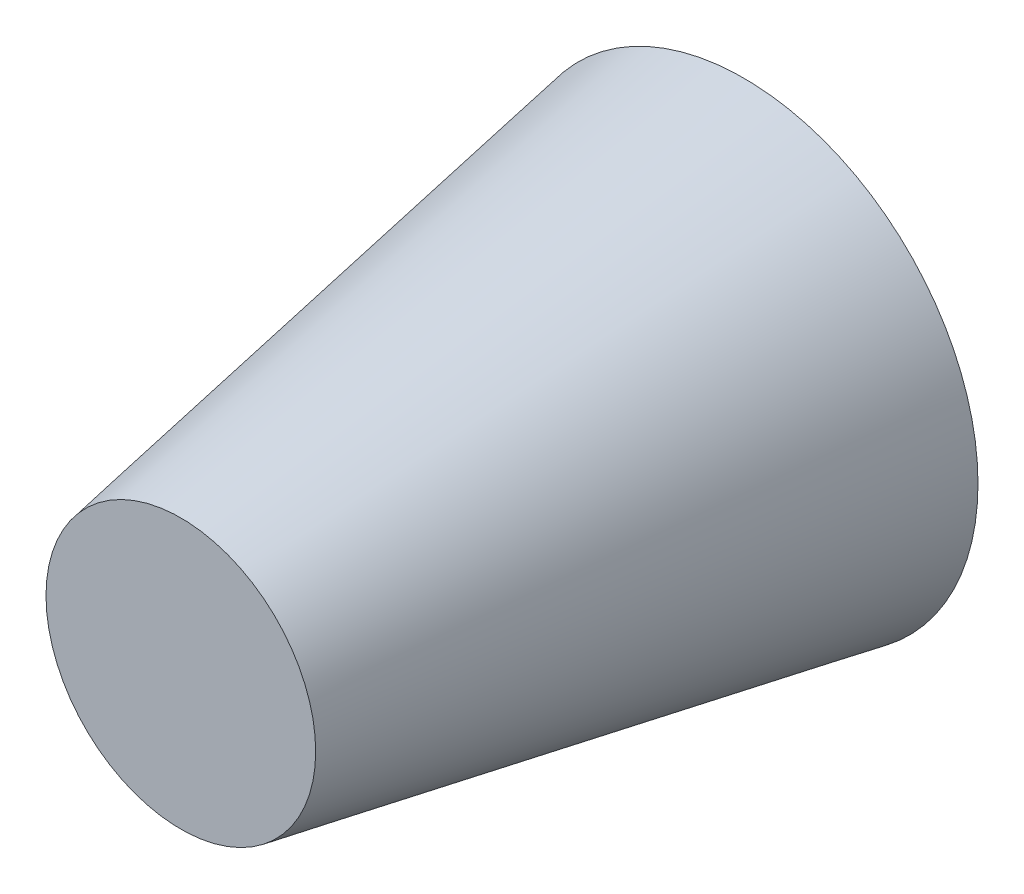
ISO-10303-21;
HEADER;
FILE_DESCRIPTION(('STEP AP214'),'2;1');
FILE_NAME('part.step','',(''),(''),'','','');
FILE_SCHEMA(('AUTOMOTIVE_DESIGN { 1 0 10303 214 1 1 1 1 }'));
ENDSEC;
DATA;
#1=APPLICATION_CONTEXT('core data for automotive mechanical design processes');
#2=APPLICATION_PROTOCOL_DEFINITION('international standard','automotive_design',2000,#1);
#3=PRODUCT_CONTEXT('',#1,'mechanical');
#4=PRODUCT('Part','Part','',(#3));
#5=PRODUCT_RELATED_PRODUCT_CATEGORY('part','',(#4));
#6=PRODUCT_DEFINITION_FORMATION('','',#4);
#7=PRODUCT_DEFINITION_CONTEXT('part definition',#1,'design');
#8=PRODUCT_DEFINITION('design','',#6,#7);
#9=PRODUCT_DEFINITION_SHAPE('','',#8);
#10=(LENGTH_UNIT() NAMED_UNIT(*) SI_UNIT(.MILLI.,.METRE.));
#11=(NAMED_UNIT(*) PLANE_ANGLE_UNIT() SI_UNIT($,.RADIAN.));
#12=(NAMED_UNIT(*) SI_UNIT($,.STERADIAN.) SOLID_ANGLE_UNIT());
#13=UNCERTAINTY_MEASURE_WITH_UNIT(LENGTH_MEASURE(1.E-05),#10,'distance_accuracy_value','');
#14=(GEOMETRIC_REPRESENTATION_CONTEXT(3) GLOBAL_UNCERTAINTY_ASSIGNED_CONTEXT((#13)) GLOBAL_UNIT_ASSIGNED_CONTEXT((#10,
#11,#12)) REPRESENTATION_CONTEXT('',''));
#15=CARTESIAN_POINT('',(0.,0.,0.));
#16=DIRECTION('',(0.,0.,1.));
#17=DIRECTION('',(1.,0.,0.));
#18=AXIS2_PLACEMENT_3D('',#15,#16,#17);
#19=CARTESIAN_POINT('',(0.,40.7624811993621,0.));
#20=DIRECTION('',(0.,0.,-1.));
#21=DIRECTION('',(1.,0.,0.));
#22=AXIS2_PLACEMENT_3D('',#19,#20,#21);
#23=CONICAL_SURFACE('',#22,20.7901294936884,0.174532925199433);
#24=CARTESIAN_POINT('',(0.,40.7624811993621,50.));
#25=DIRECTION('',(0.,0.,1.));
#26=DIRECTION('',(1.,0.,0.));
#27=AXIS2_PLACEMENT_3D('',#24,#25,#26);
#28=CIRCLE('',#27,11.9737804582651);
#29=CARTESIAN_POINT('',(11.9737804582651,40.7624811993621,50.));
#30=VERTEX_POINT('',#29);
#31=EDGE_CURVE('E10',#30,#30,#28,.T.);
#32=ORIENTED_EDGE('',*,*,#31,.F.);
#33=EDGE_LOOP('',(#32));
#34=FACE_BOUND('',#33,.T.);
#35=CARTESIAN_POINT('',(0.,40.7624811993621,0.));
#36=DIRECTION('',(0.,0.,1.));
#37=DIRECTION('',(1.,0.,0.));
#38=AXIS2_PLACEMENT_3D('',#35,#36,#37);
#39=CIRCLE('',#38,20.7901294936884);
#40=CARTESIAN_POINT('',(20.7901294936884,40.7624811993621,0.));
#41=VERTEX_POINT('',#40);
#42=EDGE_CURVE('E37',#41,#41,#39,.T.);
#43=ORIENTED_EDGE('',*,*,#42,.T.);
#44=EDGE_LOOP('',(#43));
#45=FACE_BOUND('',#44,.T.);
#46=ADVANCED_FACE('F31',(#34,#45),#23,.T.);
#47=CARTESIAN_POINT('',(0.,40.7624811993621,50.));
#48=DIRECTION('',(0.,0.,1.));
#49=DIRECTION('',(1.,0.,0.));
#50=AXIS2_PLACEMENT_3D('',#47,#48,#49);
#51=PLANE('',#50);
#52=ORIENTED_EDGE('',*,*,#31,.T.);
#53=EDGE_LOOP('',(#52));
#54=FACE_BOUND('',#53,.T.);
#55=ADVANCED_FACE('F46',(#54),#51,.T.);
#56=CARTESIAN_POINT('',(0.,40.7624811993621,0.));
#57=DIRECTION('',(0.,0.,1.));
#58=DIRECTION('',(1.,0.,0.));
#59=AXIS2_PLACEMENT_3D('',#56,#57,#58);
#60=PLANE('',#59);
#61=ORIENTED_EDGE('',*,*,#42,.F.);
#62=EDGE_LOOP('',(#61));
#63=FACE_BOUND('',#62,.T.);
#64=ADVANCED_FACE('F44',(#63),#60,.F.);
#65=CLOSED_SHELL('',(#46,#55,#64));
#66=MANIFOLD_SOLID_BREP('B2',#65);
#67=ADVANCED_BREP_SHAPE_REPRESENTATION('',(#18,#66),#14);
#68=SHAPE_DEFINITION_REPRESENTATION(#9,#67);
ENDSEC;
END-ISO-10303-21;
